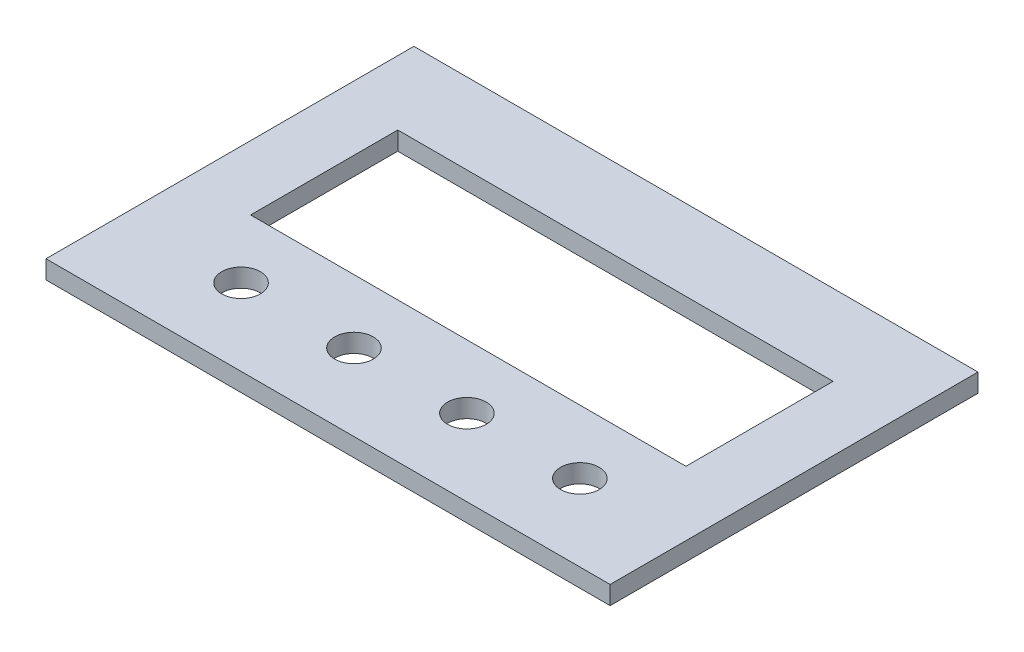
ISO-10303-21;
HEADER;
FILE_DESCRIPTION(('STEP AP214'),'2;1');
FILE_NAME('part.step','',(''),(''),'','','');
FILE_SCHEMA(('AUTOMOTIVE_DESIGN { 1 0 10303 214 1 1 1 1 }'));
ENDSEC;
DATA;
#1=APPLICATION_CONTEXT('core data for automotive mechanical design processes');
#2=APPLICATION_PROTOCOL_DEFINITION('international standard','automotive_design',2000,#1);
#3=PRODUCT_CONTEXT('',#1,'mechanical');
#4=PRODUCT('Part','Part','',(#3));
#5=PRODUCT_RELATED_PRODUCT_CATEGORY('part','',(#4));
#6=PRODUCT_DEFINITION_FORMATION('','',#4);
#7=PRODUCT_DEFINITION_CONTEXT('part definition',#1,'design');
#8=PRODUCT_DEFINITION('design','',#6,#7);
#9=PRODUCT_DEFINITION_SHAPE('','',#8);
#10=(LENGTH_UNIT() NAMED_UNIT(*) SI_UNIT(.MILLI.,.METRE.));
#11=(NAMED_UNIT(*) PLANE_ANGLE_UNIT() SI_UNIT($,.RADIAN.));
#12=(NAMED_UNIT(*) SI_UNIT($,.STERADIAN.) SOLID_ANGLE_UNIT());
#13=UNCERTAINTY_MEASURE_WITH_UNIT(LENGTH_MEASURE(1.E-05),#10,'distance_accuracy_value','');
#14=(GEOMETRIC_REPRESENTATION_CONTEXT(3) GLOBAL_UNCERTAINTY_ASSIGNED_CONTEXT((#13)) GLOBAL_UNIT_ASSIGNED_CONTEXT((#10,
#11,#12)) REPRESENTATION_CONTEXT('',''));
#15=CARTESIAN_POINT('',(0.,0.,0.));
#16=DIRECTION('',(0.,0.,1.));
#17=DIRECTION('',(1.,0.,0.));
#18=AXIS2_PLACEMENT_3D('',#15,#16,#17);
#19=CARTESIAN_POINT('',(0.,3.,0.));
#20=DIRECTION('',(0.,1.,0.));
#21=DIRECTION('',(0.,0.,1.));
#22=AXIS2_PLACEMENT_3D('',#19,#20,#21);
#23=PLANE('',#22);
#24=CARTESIAN_POINT('',(10.14,3.,17.4910179640719));
#25=DIRECTION('',(0.,1.,0.));
#26=DIRECTION('',(0.,0.,1.));
#27=AXIS2_PLACEMENT_3D('',#24,#25,#26);
#28=CIRCLE('',#27,3.15);
#29=CARTESIAN_POINT('',(10.14,3.,20.6410179640719));
#30=VERTEX_POINT('',#29);
#31=EDGE_CURVE('E245',#30,#30,#28,.T.);
#32=ORIENTED_EDGE('',*,*,#31,.F.);
#33=EDGE_LOOP('',(#32));
#34=FACE_BOUND('',#33,.T.);
#35=CARTESIAN_POINT('',(-26.7,3.,17.4910179640719));
#36=DIRECTION('',(0.,1.,0.));
#37=DIRECTION('',(0.,0.,1.));
#38=AXIS2_PLACEMENT_3D('',#35,#36,#37);
#39=CIRCLE('',#38,3.15);
#40=CARTESIAN_POINT('',(-26.7,3.,20.6410179640719));
#41=VERTEX_POINT('',#40);
#42=EDGE_CURVE('E127',#41,#41,#39,.T.);
#43=ORIENTED_EDGE('',*,*,#42,.F.);
#44=EDGE_LOOP('',(#43));
#45=FACE_BOUND('',#44,.T.);
#46=DIRECTION('',(0.,0.,-1.));
#47=VECTOR('',#46,1.);
#48=CARTESIAN_POINT('',(46.,3.,-30.));
#49=LINE('',#48,#47);
#50=CARTESIAN_POINT('',(46.,3.,30.));
#51=VERTEX_POINT('',#50);
#52=CARTESIAN_POINT('',(46.,3.,-30.));
#53=VERTEX_POINT('',#52);
#54=EDGE_CURVE('E137',#51,#53,#49,.T.);
#55=ORIENTED_EDGE('',*,*,#54,.T.);
#56=DIRECTION('',(-1.,0.,0.));
#57=VECTOR('',#56,1.);
#58=CARTESIAN_POINT('',(-46.,3.,-30.));
#59=LINE('',#58,#57);
#60=CARTESIAN_POINT('',(-46.,3.,-30.));
#61=VERTEX_POINT('',#60);
#62=EDGE_CURVE('E140',#53,#61,#59,.T.);
#63=ORIENTED_EDGE('',*,*,#62,.T.);
#64=DIRECTION('',(0.,0.,1.));
#65=VECTOR('',#64,1.);
#66=CARTESIAN_POINT('',(-46.,3.,-30.));
#67=LINE('',#66,#65);
#68=CARTESIAN_POINT('',(-46.,3.,30.));
#69=VERTEX_POINT('',#68);
#70=EDGE_CURVE('E143',#61,#69,#67,.T.);
#71=ORIENTED_EDGE('',*,*,#70,.T.);
#72=DIRECTION('',(1.,0.,0.));
#73=VECTOR('',#72,1.);
#74=CARTESIAN_POINT('',(-46.,3.,30.));
#75=LINE('',#74,#73);
#76=EDGE_CURVE('E145',#69,#51,#75,.T.);
#77=ORIENTED_EDGE('',*,*,#76,.T.);
#78=EDGE_LOOP('',(#55,#63,#71,#77));
#79=FACE_BOUND('',#78,.T.);
#80=DIRECTION('',(1.,0.,0.));
#81=VECTOR('',#80,1.);
#82=CARTESIAN_POINT('',(-35.5,3.,7.13000000000001));
#83=LINE('',#82,#81);
#84=CARTESIAN_POINT('',(-35.5,3.,7.13000000000001));
#85=VERTEX_POINT('',#84);
#86=CARTESIAN_POINT('',(35.5,3.,7.13000000000001));
#87=VERTEX_POINT('',#86);
#88=EDGE_CURVE('E106',#85,#87,#83,.T.);
#89=ORIENTED_EDGE('',*,*,#88,.F.);
#90=DIRECTION('',(0.,0.,1.));
#91=VECTOR('',#90,1.);
#92=CARTESIAN_POINT('',(-35.5,3.,-16.87));
#93=LINE('',#92,#91);
#94=CARTESIAN_POINT('',(-35.5,3.,-16.87));
#95=VERTEX_POINT('',#94);
#96=EDGE_CURVE('E98',#95,#85,#93,.T.);
#97=ORIENTED_EDGE('',*,*,#96,.F.);
#98=DIRECTION('',(-1.,0.,0.));
#99=VECTOR('',#98,1.);
#100=CARTESIAN_POINT('',(-35.5,3.,-16.87));
#101=LINE('',#100,#99);
#102=CARTESIAN_POINT('',(35.5,3.,-16.87));
#103=VERTEX_POINT('',#102);
#104=EDGE_CURVE('E121',#103,#95,#101,.T.);
#105=ORIENTED_EDGE('',*,*,#104,.F.);
#106=DIRECTION('',(0.,0.,-1.));
#107=VECTOR('',#106,1.);
#108=CARTESIAN_POINT('',(35.5,3.,-16.87));
#109=LINE('',#108,#107);
#110=EDGE_CURVE('E119',#87,#103,#109,.T.);
#111=ORIENTED_EDGE('',*,*,#110,.F.);
#112=EDGE_LOOP('',(#89,#97,#105,#111));
#113=FACE_BOUND('',#112,.T.);
#114=CARTESIAN_POINT('',(-8.28,3.,17.4910179640719));
#115=DIRECTION('',(0.,1.,0.));
#116=DIRECTION('',(0.,0.,1.));
#117=AXIS2_PLACEMENT_3D('',#114,#115,#116);
#118=CIRCLE('',#117,3.15);
#119=CARTESIAN_POINT('',(-8.28,3.,20.6410179640719));
#120=VERTEX_POINT('',#119);
#121=EDGE_CURVE('E251',#120,#120,#118,.T.);
#122=ORIENTED_EDGE('',*,*,#121,.F.);
#123=EDGE_LOOP('',(#122));
#124=FACE_BOUND('',#123,.T.);
#125=CARTESIAN_POINT('',(28.56,3.,17.4910179640719));
#126=DIRECTION('',(0.,1.,0.));
#127=DIRECTION('',(0.,0.,1.));
#128=AXIS2_PLACEMENT_3D('',#125,#126,#127);
#129=CIRCLE('',#128,3.15);
#130=CARTESIAN_POINT('',(28.56,3.,20.6410179640719));
#131=VERTEX_POINT('',#130);
#132=EDGE_CURVE('E236',#131,#131,#129,.T.);
#133=ORIENTED_EDGE('',*,*,#132,.F.);
#134=EDGE_LOOP('',(#133));
#135=FACE_BOUND('',#134,.T.);
#136=ADVANCED_FACE('F33',(#34,#45,#79,#113,#124,#135),#23,.T.);
#137=CARTESIAN_POINT('',(0.,0.,0.));
#138=DIRECTION('',(0.,1.,0.));
#139=DIRECTION('',(0.,0.,1.));
#140=AXIS2_PLACEMENT_3D('',#137,#138,#139);
#141=PLANE('',#140);
#142=DIRECTION('',(0.,0.,-1.));
#143=VECTOR('',#142,1.);
#144=CARTESIAN_POINT('',(46.,0.,-30.));
#145=LINE('',#144,#143);
#146=CARTESIAN_POINT('',(46.,0.,30.));
#147=VERTEX_POINT('',#146);
#148=CARTESIAN_POINT('',(46.,0.,-30.));
#149=VERTEX_POINT('',#148);
#150=EDGE_CURVE('E114',#147,#149,#145,.T.);
#151=ORIENTED_EDGE('',*,*,#150,.F.);
#152=DIRECTION('',(1.,0.,0.));
#153=VECTOR('',#152,1.);
#154=CARTESIAN_POINT('',(-46.,0.,30.));
#155=LINE('',#154,#153);
#156=CARTESIAN_POINT('',(-46.,0.,30.));
#157=VERTEX_POINT('',#156);
#158=EDGE_CURVE('E141',#157,#147,#155,.T.);
#159=ORIENTED_EDGE('',*,*,#158,.F.);
#160=DIRECTION('',(0.,0.,1.));
#161=VECTOR('',#160,1.);
#162=CARTESIAN_POINT('',(-46.,0.,-30.));
#163=LINE('',#162,#161);
#164=CARTESIAN_POINT('',(-46.,0.,-30.));
#165=VERTEX_POINT('',#164);
#166=EDGE_CURVE('E152',#165,#157,#163,.T.);
#167=ORIENTED_EDGE('',*,*,#166,.F.);
#168=DIRECTION('',(-1.,0.,0.));
#169=VECTOR('',#168,1.);
#170=CARTESIAN_POINT('',(-46.,0.,-30.));
#171=LINE('',#170,#169);
#172=EDGE_CURVE('E150',#149,#165,#171,.T.);
#173=ORIENTED_EDGE('',*,*,#172,.F.);
#174=EDGE_LOOP('',(#151,#159,#167,#173));
#175=FACE_BOUND('',#174,.T.);
#176=DIRECTION('',(0.,0.,1.));
#177=VECTOR('',#176,1.);
#178=CARTESIAN_POINT('',(-35.5,0.,-16.87));
#179=LINE('',#178,#177);
#180=CARTESIAN_POINT('',(-35.5,0.,-16.87));
#181=VERTEX_POINT('',#180);
#182=CARTESIAN_POINT('',(-35.5,0.,7.13000000000001));
#183=VERTEX_POINT('',#182);
#184=EDGE_CURVE('E56',#181,#183,#179,.T.);
#185=ORIENTED_EDGE('',*,*,#184,.T.);
#186=DIRECTION('',(1.,0.,0.));
#187=VECTOR('',#186,1.);
#188=CARTESIAN_POINT('',(-35.5,0.,7.13000000000001));
#189=LINE('',#188,#187);
#190=CARTESIAN_POINT('',(35.5,0.,7.13000000000001));
#191=VERTEX_POINT('',#190);
#192=EDGE_CURVE('E113',#183,#191,#189,.T.);
#193=ORIENTED_EDGE('',*,*,#192,.T.);
#194=DIRECTION('',(0.,0.,-1.));
#195=VECTOR('',#194,1.);
#196=CARTESIAN_POINT('',(35.5,0.,-16.87));
#197=LINE('',#196,#195);
#198=CARTESIAN_POINT('',(35.5,0.,-16.87));
#199=VERTEX_POINT('',#198);
#200=EDGE_CURVE('E129',#191,#199,#197,.T.);
#201=ORIENTED_EDGE('',*,*,#200,.T.);
#202=DIRECTION('',(-1.,0.,0.));
#203=VECTOR('',#202,1.);
#204=CARTESIAN_POINT('',(-35.5,0.,-16.87));
#205=LINE('',#204,#203);
#206=EDGE_CURVE('E107',#199,#181,#205,.T.);
#207=ORIENTED_EDGE('',*,*,#206,.T.);
#208=EDGE_LOOP('',(#185,#193,#201,#207));
#209=FACE_BOUND('',#208,.T.);
#210=CARTESIAN_POINT('',(-26.7,0.,17.4910179640719));
#211=DIRECTION('',(0.,1.,0.));
#212=DIRECTION('',(0.,0.,1.));
#213=AXIS2_PLACEMENT_3D('',#210,#211,#212);
#214=CIRCLE('',#213,3.15);
#215=CARTESIAN_POINT('',(-26.7,0.,20.6410179640719));
#216=VERTEX_POINT('',#215);
#217=EDGE_CURVE('E254',#216,#216,#214,.T.);
#218=ORIENTED_EDGE('',*,*,#217,.T.);
#219=EDGE_LOOP('',(#218));
#220=FACE_BOUND('',#219,.T.);
#221=CARTESIAN_POINT('',(-8.28,0.,17.4910179640719));
#222=DIRECTION('',(0.,1.,0.));
#223=DIRECTION('',(0.,0.,1.));
#224=AXIS2_PLACEMENT_3D('',#221,#222,#223);
#225=CIRCLE('',#224,3.15);
#226=CARTESIAN_POINT('',(-8.28,0.,20.6410179640719));
#227=VERTEX_POINT('',#226);
#228=EDGE_CURVE('E248',#227,#227,#225,.T.);
#229=ORIENTED_EDGE('',*,*,#228,.T.);
#230=EDGE_LOOP('',(#229));
#231=FACE_BOUND('',#230,.T.);
#232=CARTESIAN_POINT('',(10.14,0.,17.4910179640719));
#233=DIRECTION('',(0.,1.,0.));
#234=DIRECTION('',(0.,0.,1.));
#235=AXIS2_PLACEMENT_3D('',#232,#233,#234);
#236=CIRCLE('',#235,3.15);
#237=CARTESIAN_POINT('',(10.14,0.,20.6410179640719));
#238=VERTEX_POINT('',#237);
#239=EDGE_CURVE('E242',#238,#238,#236,.T.);
#240=ORIENTED_EDGE('',*,*,#239,.T.);
#241=EDGE_LOOP('',(#240));
#242=FACE_BOUND('',#241,.T.);
#243=CARTESIAN_POINT('',(28.56,0.,17.4910179640719));
#244=DIRECTION('',(0.,1.,0.));
#245=DIRECTION('',(0.,0.,1.));
#246=AXIS2_PLACEMENT_3D('',#243,#244,#245);
#247=CIRCLE('',#246,3.15);
#248=CARTESIAN_POINT('',(28.56,0.,20.6410179640719));
#249=VERTEX_POINT('',#248);
#250=EDGE_CURVE('E239',#249,#249,#247,.T.);
#251=ORIENTED_EDGE('',*,*,#250,.T.);
#252=EDGE_LOOP('',(#251));
#253=FACE_BOUND('',#252,.T.);
#254=ADVANCED_FACE('F170',(#175,#209,#220,#231,#242,#253),#141,.F.);
#255=CARTESIAN_POINT('',(46.,3.,-30.));
#256=DIRECTION('',(-1.,0.,0.));
#257=DIRECTION('',(0.,0.,1.));
#258=AXIS2_PLACEMENT_3D('',#255,#256,#257);
#259=PLANE('',#258);
#260=ORIENTED_EDGE('',*,*,#150,.T.);
#261=DIRECTION('',(0.,-1.,0.));
#262=VECTOR('',#261,1.);
#263=CARTESIAN_POINT('',(46.,3.,-30.));
#264=LINE('',#263,#262);
#265=EDGE_CURVE('E11',#53,#149,#264,.T.);
#266=ORIENTED_EDGE('',*,*,#265,.F.);
#267=ORIENTED_EDGE('',*,*,#54,.F.);
#268=DIRECTION('',(0.,-1.,0.));
#269=VECTOR('',#268,1.);
#270=CARTESIAN_POINT('',(46.,3.,30.));
#271=LINE('',#270,#269);
#272=EDGE_CURVE('E147',#51,#147,#271,.T.);
#273=ORIENTED_EDGE('',*,*,#272,.T.);
#274=EDGE_LOOP('',(#260,#266,#267,#273));
#275=FACE_BOUND('',#274,.T.);
#276=ADVANCED_FACE('F35',(#275),#259,.F.);
#277=CARTESIAN_POINT('',(-46.,3.,-30.));
#278=DIRECTION('',(0.,0.,1.));
#279=DIRECTION('',(1.,0.,0.));
#280=AXIS2_PLACEMENT_3D('',#277,#278,#279);
#281=PLANE('',#280);
#282=ORIENTED_EDGE('',*,*,#172,.T.);
#283=DIRECTION('',(0.,-1.,0.));
#284=VECTOR('',#283,1.);
#285=CARTESIAN_POINT('',(-46.,3.,-30.));
#286=LINE('',#285,#284);
#287=EDGE_CURVE('E41',#61,#165,#286,.T.);
#288=ORIENTED_EDGE('',*,*,#287,.F.);
#289=ORIENTED_EDGE('',*,*,#62,.F.);
#290=ORIENTED_EDGE('',*,*,#265,.T.);
#291=EDGE_LOOP('',(#282,#288,#289,#290));
#292=FACE_BOUND('',#291,.T.);
#293=ADVANCED_FACE('F180',(#292),#281,.F.);
#294=CARTESIAN_POINT('',(-46.,3.,-30.));
#295=DIRECTION('',(1.,0.,0.));
#296=DIRECTION('',(0.,0.,-1.));
#297=AXIS2_PLACEMENT_3D('',#294,#295,#296);
#298=PLANE('',#297);
#299=ORIENTED_EDGE('',*,*,#166,.T.);
#300=DIRECTION('',(0.,-1.,0.));
#301=VECTOR('',#300,1.);
#302=CARTESIAN_POINT('',(-46.,3.,30.));
#303=LINE('',#302,#301);
#304=EDGE_CURVE('E157',#69,#157,#303,.T.);
#305=ORIENTED_EDGE('',*,*,#304,.F.);
#306=ORIENTED_EDGE('',*,*,#70,.F.);
#307=ORIENTED_EDGE('',*,*,#287,.T.);
#308=EDGE_LOOP('',(#299,#305,#306,#307));
#309=FACE_BOUND('',#308,.T.);
#310=ADVANCED_FACE('F164',(#309),#298,.F.);
#311=CARTESIAN_POINT('',(-46.,3.,30.));
#312=DIRECTION('',(0.,0.,-1.));
#313=DIRECTION('',(-1.,0.,0.));
#314=AXIS2_PLACEMENT_3D('',#311,#312,#313);
#315=PLANE('',#314);
#316=ORIENTED_EDGE('',*,*,#158,.T.);
#317=ORIENTED_EDGE('',*,*,#272,.F.);
#318=ORIENTED_EDGE('',*,*,#76,.F.);
#319=ORIENTED_EDGE('',*,*,#304,.T.);
#320=EDGE_LOOP('',(#316,#317,#318,#319));
#321=FACE_BOUND('',#320,.T.);
#322=ADVANCED_FACE('F174',(#321),#315,.F.);
#323=CARTESIAN_POINT('',(-35.5,3.,-16.87));
#324=DIRECTION('',(1.,0.,0.));
#325=DIRECTION('',(0.,0.,-1.));
#326=AXIS2_PLACEMENT_3D('',#323,#324,#325);
#327=PLANE('',#326);
#328=ORIENTED_EDGE('',*,*,#184,.F.);
#329=DIRECTION('',(0.,-1.,0.));
#330=VECTOR('',#329,1.);
#331=CARTESIAN_POINT('',(-35.5,3.,-16.87));
#332=LINE('',#331,#330);
#333=EDGE_CURVE('E102',#95,#181,#332,.T.);
#334=ORIENTED_EDGE('',*,*,#333,.F.);
#335=ORIENTED_EDGE('',*,*,#96,.T.);
#336=DIRECTION('',(0.,-1.,0.));
#337=VECTOR('',#336,1.);
#338=CARTESIAN_POINT('',(-35.5,3.,7.13000000000001));
#339=LINE('',#338,#337);
#340=EDGE_CURVE('E101',#85,#183,#339,.T.);
#341=ORIENTED_EDGE('',*,*,#340,.T.);
#342=EDGE_LOOP('',(#328,#334,#335,#341));
#343=FACE_BOUND('',#342,.T.);
#344=ADVANCED_FACE('F100',(#343),#327,.T.);
#345=CARTESIAN_POINT('',(-35.5,3.,7.13000000000001));
#346=DIRECTION('',(0.,0.,-1.));
#347=DIRECTION('',(-1.,0.,0.));
#348=AXIS2_PLACEMENT_3D('',#345,#346,#347);
#349=PLANE('',#348);
#350=ORIENTED_EDGE('',*,*,#192,.F.);
#351=ORIENTED_EDGE('',*,*,#340,.F.);
#352=ORIENTED_EDGE('',*,*,#88,.T.);
#353=DIRECTION('',(0.,-1.,0.));
#354=VECTOR('',#353,1.);
#355=CARTESIAN_POINT('',(35.5,3.,7.13000000000001));
#356=LINE('',#355,#354);
#357=EDGE_CURVE('E115',#87,#191,#356,.T.);
#358=ORIENTED_EDGE('',*,*,#357,.T.);
#359=EDGE_LOOP('',(#350,#351,#352,#358));
#360=FACE_BOUND('',#359,.T.);
#361=ADVANCED_FACE('F110',(#360),#349,.T.);
#362=CARTESIAN_POINT('',(35.5,3.,-16.87));
#363=DIRECTION('',(-1.,0.,0.));
#364=DIRECTION('',(0.,0.,1.));
#365=AXIS2_PLACEMENT_3D('',#362,#363,#364);
#366=PLANE('',#365);
#367=ORIENTED_EDGE('',*,*,#200,.F.);
#368=ORIENTED_EDGE('',*,*,#357,.F.);
#369=ORIENTED_EDGE('',*,*,#110,.T.);
#370=DIRECTION('',(0.,-1.,0.));
#371=VECTOR('',#370,1.);
#372=CARTESIAN_POINT('',(35.5,3.,-16.87));
#373=LINE('',#372,#371);
#374=EDGE_CURVE('E48',#103,#199,#373,.T.);
#375=ORIENTED_EDGE('',*,*,#374,.T.);
#376=EDGE_LOOP('',(#367,#368,#369,#375));
#377=FACE_BOUND('',#376,.T.);
#378=ADVANCED_FACE('F206',(#377),#366,.T.);
#379=CARTESIAN_POINT('',(-35.5,3.,-16.87));
#380=DIRECTION('',(0.,0.,1.));
#381=DIRECTION('',(1.,0.,0.));
#382=AXIS2_PLACEMENT_3D('',#379,#380,#381);
#383=PLANE('',#382);
#384=ORIENTED_EDGE('',*,*,#206,.F.);
#385=ORIENTED_EDGE('',*,*,#374,.F.);
#386=ORIENTED_EDGE('',*,*,#104,.T.);
#387=ORIENTED_EDGE('',*,*,#333,.T.);
#388=EDGE_LOOP('',(#384,#385,#386,#387));
#389=FACE_BOUND('',#388,.T.);
#390=ADVANCED_FACE('F210',(#389),#383,.T.);
#391=CARTESIAN_POINT('',(-26.7,3.,17.4910179640719));
#392=DIRECTION('',(0.,-1.,0.));
#393=DIRECTION('',(0.,0.,-1.));
#394=AXIS2_PLACEMENT_3D('',#391,#392,#393);
#395=CYLINDRICAL_SURFACE('',#394,3.15);
#396=ORIENTED_EDGE('',*,*,#42,.T.);
#397=EDGE_LOOP('',(#396));
#398=FACE_BOUND('',#397,.T.);
#399=ORIENTED_EDGE('',*,*,#217,.F.);
#400=EDGE_LOOP('',(#399));
#401=FACE_BOUND('',#400,.T.);
#402=ADVANCED_FACE('F216',(#398,#401),#395,.F.);
#403=CARTESIAN_POINT('',(-8.28,3.,17.4910179640719));
#404=DIRECTION('',(0.,-1.,0.));
#405=DIRECTION('',(0.,0.,-1.));
#406=AXIS2_PLACEMENT_3D('',#403,#404,#405);
#407=CYLINDRICAL_SURFACE('',#406,3.15);
#408=ORIENTED_EDGE('',*,*,#121,.T.);
#409=EDGE_LOOP('',(#408));
#410=FACE_BOUND('',#409,.T.);
#411=ORIENTED_EDGE('',*,*,#228,.F.);
#412=EDGE_LOOP('',(#411));
#413=FACE_BOUND('',#412,.T.);
#414=ADVANCED_FACE('F219',(#410,#413),#407,.F.);
#415=CARTESIAN_POINT('',(10.14,3.,17.4910179640719));
#416=DIRECTION('',(0.,-1.,0.));
#417=DIRECTION('',(0.,0.,-1.));
#418=AXIS2_PLACEMENT_3D('',#415,#416,#417);
#419=CYLINDRICAL_SURFACE('',#418,3.15);
#420=ORIENTED_EDGE('',*,*,#31,.T.);
#421=EDGE_LOOP('',(#420));
#422=FACE_BOUND('',#421,.T.);
#423=ORIENTED_EDGE('',*,*,#239,.F.);
#424=EDGE_LOOP('',(#423));
#425=FACE_BOUND('',#424,.T.);
#426=ADVANCED_FACE('F223',(#422,#425),#419,.F.);
#427=CARTESIAN_POINT('',(28.56,3.,17.4910179640719));
#428=DIRECTION('',(0.,-1.,0.));
#429=DIRECTION('',(0.,0.,-1.));
#430=AXIS2_PLACEMENT_3D('',#427,#428,#429);
#431=CYLINDRICAL_SURFACE('',#430,3.15);
#432=ORIENTED_EDGE('',*,*,#132,.T.);
#433=EDGE_LOOP('',(#432));
#434=FACE_BOUND('',#433,.T.);
#435=ORIENTED_EDGE('',*,*,#250,.F.);
#436=EDGE_LOOP('',(#435));
#437=FACE_BOUND('',#436,.T.);
#438=ADVANCED_FACE('F227',(#434,#437),#431,.F.);
#439=CLOSED_SHELL('',(#136,#254,#276,#293,#310,#322,#344,#361,#378,#390,#402,#414,#426,#438));
#440=MANIFOLD_SOLID_BREP('B2',#439);
#441=ADVANCED_BREP_SHAPE_REPRESENTATION('',(#18,#440),#14);
#442=SHAPE_DEFINITION_REPRESENTATION(#9,#441);
ENDSEC;
END-ISO-10303-21;
